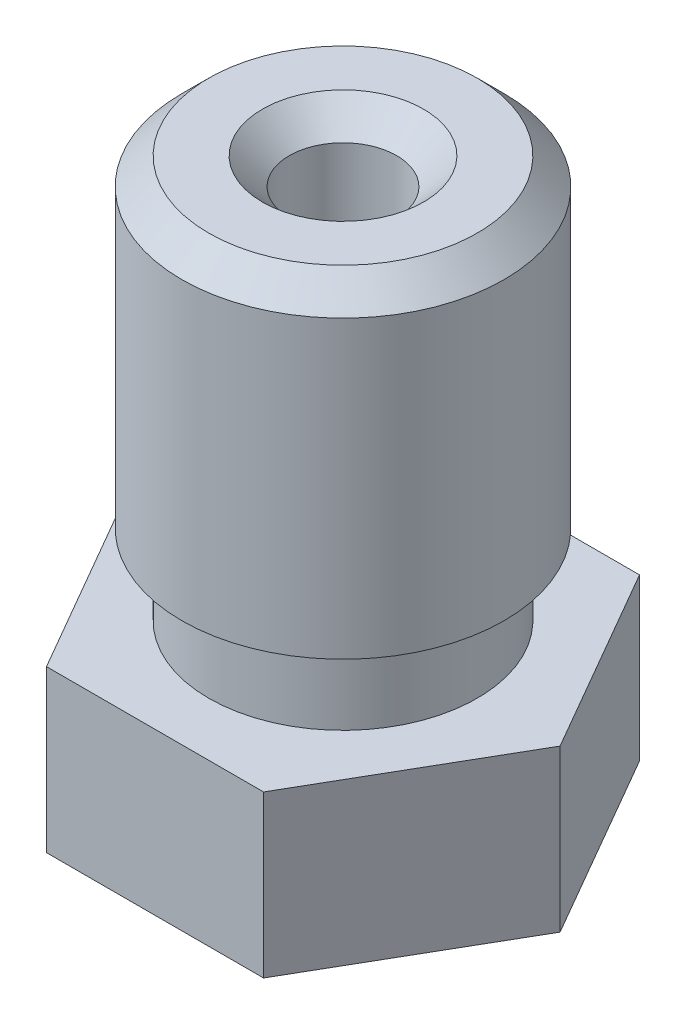
ISO-10303-21;
HEADER;
FILE_DESCRIPTION(('STEP AP214'),'2;1');
FILE_NAME('part.step','',(''),(''),'','','');
FILE_SCHEMA(('AUTOMOTIVE_DESIGN { 1 0 10303 214 1 1 1 1 }'));
ENDSEC;
DATA;
#1=APPLICATION_CONTEXT('core data for automotive mechanical design processes');
#2=APPLICATION_PROTOCOL_DEFINITION('international standard','automotive_design',2000,#1);
#3=PRODUCT_CONTEXT('',#1,'mechanical');
#4=PRODUCT('Part','Part','',(#3));
#5=PRODUCT_RELATED_PRODUCT_CATEGORY('part','',(#4));
#6=PRODUCT_DEFINITION_FORMATION('','',#4);
#7=PRODUCT_DEFINITION_CONTEXT('part definition',#1,'design');
#8=PRODUCT_DEFINITION('design','',#6,#7);
#9=PRODUCT_DEFINITION_SHAPE('','',#8);
#10=(LENGTH_UNIT() NAMED_UNIT(*) SI_UNIT(.MILLI.,.METRE.));
#11=(NAMED_UNIT(*) PLANE_ANGLE_UNIT() SI_UNIT($,.RADIAN.));
#12=(NAMED_UNIT(*) SI_UNIT($,.STERADIAN.) SOLID_ANGLE_UNIT());
#13=UNCERTAINTY_MEASURE_WITH_UNIT(LENGTH_MEASURE(1.E-05),#10,'distance_accuracy_value','');
#14=(GEOMETRIC_REPRESENTATION_CONTEXT(3) GLOBAL_UNCERTAINTY_ASSIGNED_CONTEXT((#13)) GLOBAL_UNIT_ASSIGNED_CONTEXT((#10,
#11,#12)) REPRESENTATION_CONTEXT('',''));
#15=CARTESIAN_POINT('',(0.,0.,0.));
#16=DIRECTION('',(0.,0.,1.));
#17=DIRECTION('',(1.,0.,0.));
#18=AXIS2_PLACEMENT_3D('',#15,#16,#17);
#19=CARTESIAN_POINT('',(0.,4.5,0.));
#20=DIRECTION('',(0.,1.,0.));
#21=DIRECTION('',(0.,0.,1.));
#22=AXIS2_PLACEMENT_3D('',#19,#20,#21);
#23=CYLINDRICAL_SURFACE('',#22,3.);
#24=CARTESIAN_POINT('',(0.,9.9999999999834,0.));
#25=DIRECTION('',(0.,1.,0.));
#26=DIRECTION('',(0.,0.,1.));
#27=AXIS2_PLACEMENT_3D('',#24,#25,#26);
#28=CIRCLE('',#27,3.);
#29=CARTESIAN_POINT('',(0.,9.9999999999834,3.));
#30=VERTEX_POINT('',#29);
#31=EDGE_CURVE('E11',#30,#30,#28,.F.);
#32=ORIENTED_EDGE('',*,*,#31,.T.);
#33=EDGE_LOOP('',(#32));
#34=FACE_BOUND('',#33,.T.);
#35=CARTESIAN_POINT('',(0.,4.5,0.));
#36=DIRECTION('',(0.,1.,0.));
#37=DIRECTION('',(0.,0.,1.));
#38=AXIS2_PLACEMENT_3D('',#35,#36,#37);
#39=CIRCLE('',#38,3.);
#40=CARTESIAN_POINT('',(0.,4.5,3.));
#41=VERTEX_POINT('',#40);
#42=EDGE_CURVE('E151',#41,#41,#39,.T.);
#43=ORIENTED_EDGE('',*,*,#42,.T.);
#44=EDGE_LOOP('',(#43));
#45=FACE_BOUND('',#44,.T.);
#46=ADVANCED_FACE('F37',(#34,#45),#23,.T.);
#47=CARTESIAN_POINT('',(3.,4.5,0.));
#48=DIRECTION('',(0.,-1.,0.));
#49=DIRECTION('',(0.,0.,-1.));
#50=AXIS2_PLACEMENT_3D('',#47,#48,#49);
#51=PLANE('',#50);
#52=CARTESIAN_POINT('',(0.,4.5,0.));
#53=DIRECTION('',(0.,-1.,0.));
#54=DIRECTION('',(0.,0.,-1.));
#55=AXIS2_PLACEMENT_3D('',#52,#53,#54);
#56=CIRCLE('',#55,2.5);
#57=CARTESIAN_POINT('',(0.,4.5,-2.5));
#58=VERTEX_POINT('',#57);
#59=EDGE_CURVE('E152',#58,#58,#56,.T.);
#60=ORIENTED_EDGE('',*,*,#59,.F.);
#61=EDGE_LOOP('',(#60));
#62=FACE_BOUND('',#61,.T.);
#63=ORIENTED_EDGE('',*,*,#42,.F.);
#64=EDGE_LOOP('',(#63));
#65=FACE_BOUND('',#64,.T.);
#66=ADVANCED_FACE('F218',(#62,#65),#51,.T.);
#67=CARTESIAN_POINT('',(0.,10.5,0.));
#68=DIRECTION('',(0.,1.,0.));
#69=DIRECTION('',(0.,0.,1.));
#70=AXIS2_PLACEMENT_3D('',#67,#68,#69);
#71=PLANE('',#70);
#72=CARTESIAN_POINT('',(-1.10963134903613E-11,10.5,0.));
#73=DIRECTION('',(0.,1.,0.));
#74=DIRECTION('',(0.,0.,1.));
#75=AXIS2_PLACEMENT_3D('',#72,#73,#74);
#76=CIRCLE('',#75,1.5000000000277);
#77=CARTESIAN_POINT('',(-1.10963134903613E-11,10.5,1.5000000000277));
#78=VERTEX_POINT('',#77);
#79=EDGE_CURVE('E46',#78,#78,#76,.F.);
#80=ORIENTED_EDGE('',*,*,#79,.T.);
#81=EDGE_LOOP('',(#80));
#82=FACE_BOUND('',#81,.T.);
#83=CARTESIAN_POINT('',(0.,10.5,0.));
#84=DIRECTION('',(0.,1.,0.));
#85=DIRECTION('',(0.,0.,1.));
#86=AXIS2_PLACEMENT_3D('',#83,#84,#85);
#87=CIRCLE('',#86,2.4999999999834);
#88=CARTESIAN_POINT('',(0.,10.5,2.4999999999834));
#89=VERTEX_POINT('',#88);
#90=EDGE_CURVE('E161',#89,#89,#87,.T.);
#91=ORIENTED_EDGE('',*,*,#90,.T.);
#92=EDGE_LOOP('',(#91));
#93=FACE_BOUND('',#92,.T.);
#94=ADVANCED_FACE('F166',(#82,#93),#71,.T.);
#95=CARTESIAN_POINT('',(0.,3.,0.));
#96=DIRECTION('',(0.,1.,0.));
#97=DIRECTION('',(0.,0.,1.));
#98=AXIS2_PLACEMENT_3D('',#95,#96,#97);
#99=CYLINDRICAL_SURFACE('',#98,2.5);
#100=CARTESIAN_POINT('',(0.,3.,0.));
#101=DIRECTION('',(0.,-1.,0.));
#102=DIRECTION('',(0.,0.,-1.));
#103=AXIS2_PLACEMENT_3D('',#100,#101,#102);
#104=CIRCLE('',#103,2.5);
#105=CARTESIAN_POINT('',(0.,3.,-2.5));
#106=VERTEX_POINT('',#105);
#107=EDGE_CURVE('E143',#106,#106,#104,.T.);
#108=ORIENTED_EDGE('',*,*,#107,.F.);
#109=EDGE_LOOP('',(#108));
#110=FACE_BOUND('',#109,.T.);
#111=ORIENTED_EDGE('',*,*,#59,.T.);
#112=EDGE_LOOP('',(#111));
#113=FACE_BOUND('',#112,.T.);
#114=ADVANCED_FACE('F214',(#110,#113),#99,.T.);
#115=CARTESIAN_POINT('',(-4.04145188432738,0.,0.));
#116=DIRECTION('',(-0.866025403784439,0.,0.5));
#117=DIRECTION('',(0.5,0.,0.866025403784439));
#118=AXIS2_PLACEMENT_3D('',#115,#116,#117);
#119=PLANE('',#118);
#120=DIRECTION('',(0.5,0.,0.866025403784439));
#121=VECTOR('',#120,1.);
#122=CARTESIAN_POINT('',(-4.04145188432738,3.,0.));
#123=LINE('',#122,#121);
#124=CARTESIAN_POINT('',(-4.04145188432738,3.,0.));
#125=VERTEX_POINT('',#124);
#126=CARTESIAN_POINT('',(-2.02072594216369,3.,3.5));
#127=VERTEX_POINT('',#126);
#128=EDGE_CURVE('E125',#125,#127,#123,.T.);
#129=ORIENTED_EDGE('',*,*,#128,.F.);
#130=DIRECTION('',(0.,1.,0.));
#131=VECTOR('',#130,1.);
#132=CARTESIAN_POINT('',(-4.04145188432738,0.,0.));
#133=LINE('',#132,#131);
#134=CARTESIAN_POINT('',(-4.04145188432738,0.,0.));
#135=VERTEX_POINT('',#134);
#136=EDGE_CURVE('E54',#135,#125,#133,.T.);
#137=ORIENTED_EDGE('',*,*,#136,.F.);
#138=DIRECTION('',(0.5,0.,0.866025403784439));
#139=VECTOR('',#138,1.);
#140=CARTESIAN_POINT('',(-4.04145188432738,0.,0.));
#141=LINE('',#140,#139);
#142=CARTESIAN_POINT('',(-2.02072594216369,0.,3.5));
#143=VERTEX_POINT('',#142);
#144=EDGE_CURVE('E141',#135,#143,#141,.T.);
#145=ORIENTED_EDGE('',*,*,#144,.T.);
#146=DIRECTION('',(0.,1.,0.));
#147=VECTOR('',#146,1.);
#148=CARTESIAN_POINT('',(-2.02072594216369,0.,3.5));
#149=LINE('',#148,#147);
#150=EDGE_CURVE('E89',#143,#127,#149,.T.);
#151=ORIENTED_EDGE('',*,*,#150,.T.);
#152=EDGE_LOOP('',(#129,#137,#145,#151));
#153=FACE_BOUND('',#152,.T.);
#154=ADVANCED_FACE('F203',(#153),#119,.T.);
#155=CARTESIAN_POINT('',(-2.02072594216369,0.,-3.5));
#156=DIRECTION('',(-0.866025403784439,0.,-0.5));
#157=DIRECTION('',(-0.5,0.,0.866025403784439));
#158=AXIS2_PLACEMENT_3D('',#155,#156,#157);
#159=PLANE('',#158);
#160=DIRECTION('',(-0.5,0.,0.866025403784439));
#161=VECTOR('',#160,1.);
#162=CARTESIAN_POINT('',(-2.02072594216369,3.,-3.5));
#163=LINE('',#162,#161);
#164=CARTESIAN_POINT('',(-2.02072594216369,3.,-3.5));
#165=VERTEX_POINT('',#164);
#166=EDGE_CURVE('E138',#165,#125,#163,.T.);
#167=ORIENTED_EDGE('',*,*,#166,.F.);
#168=DIRECTION('',(0.,1.,0.));
#169=VECTOR('',#168,1.);
#170=CARTESIAN_POINT('',(-2.02072594216369,0.,-3.5));
#171=LINE('',#170,#169);
#172=CARTESIAN_POINT('',(-2.02072594216369,0.,-3.5));
#173=VERTEX_POINT('',#172);
#174=EDGE_CURVE('E77',#173,#165,#171,.T.);
#175=ORIENTED_EDGE('',*,*,#174,.F.);
#176=DIRECTION('',(-0.5,0.,0.866025403784439));
#177=VECTOR('',#176,1.);
#178=CARTESIAN_POINT('',(-2.02072594216369,0.,-3.5));
#179=LINE('',#178,#177);
#180=EDGE_CURVE('E115',#173,#135,#179,.T.);
#181=ORIENTED_EDGE('',*,*,#180,.T.);
#182=ORIENTED_EDGE('',*,*,#136,.T.);
#183=EDGE_LOOP('',(#167,#175,#181,#182));
#184=FACE_BOUND('',#183,.T.);
#185=ADVANCED_FACE('F206',(#184),#159,.T.);
#186=CARTESIAN_POINT('',(2.02072594216369,0.,-3.5));
#187=DIRECTION('',(0.,0.,-1.));
#188=DIRECTION('',(-1.,0.,0.));
#189=AXIS2_PLACEMENT_3D('',#186,#187,#188);
#190=PLANE('',#189);
#191=DIRECTION('',(-1.,0.,0.));
#192=VECTOR('',#191,1.);
#193=CARTESIAN_POINT('',(2.02072594216369,3.,-3.5));
#194=LINE('',#193,#192);
#195=CARTESIAN_POINT('',(2.02072594216369,3.,-3.5));
#196=VERTEX_POINT('',#195);
#197=EDGE_CURVE('E102',#196,#165,#194,.T.);
#198=ORIENTED_EDGE('',*,*,#197,.F.);
#199=DIRECTION('',(0.,1.,0.));
#200=VECTOR('',#199,1.);
#201=CARTESIAN_POINT('',(2.02072594216369,0.,-3.5));
#202=LINE('',#201,#200);
#203=CARTESIAN_POINT('',(2.02072594216369,0.,-3.5));
#204=VERTEX_POINT('',#203);
#205=EDGE_CURVE('E97',#204,#196,#202,.T.);
#206=ORIENTED_EDGE('',*,*,#205,.F.);
#207=DIRECTION('',(-1.,0.,0.));
#208=VECTOR('',#207,1.);
#209=CARTESIAN_POINT('',(2.02072594216369,0.,-3.5));
#210=LINE('',#209,#208);
#211=EDGE_CURVE('E100',#204,#173,#210,.T.);
#212=ORIENTED_EDGE('',*,*,#211,.T.);
#213=ORIENTED_EDGE('',*,*,#174,.T.);
#214=EDGE_LOOP('',(#198,#206,#212,#213));
#215=FACE_BOUND('',#214,.T.);
#216=ADVANCED_FACE('F99',(#215),#190,.T.);
#217=CARTESIAN_POINT('',(4.04145188432738,0.,0.));
#218=DIRECTION('',(0.866025403784439,0.,-0.5));
#219=DIRECTION('',(-0.5,0.,-0.866025403784439));
#220=AXIS2_PLACEMENT_3D('',#217,#218,#219);
#221=PLANE('',#220);
#222=DIRECTION('',(-0.5,0.,-0.866025403784439));
#223=VECTOR('',#222,1.);
#224=CARTESIAN_POINT('',(4.04145188432738,3.,0.));
#225=LINE('',#224,#223);
#226=CARTESIAN_POINT('',(4.04145188432738,3.,0.));
#227=VERTEX_POINT('',#226);
#228=EDGE_CURVE('E135',#227,#196,#225,.T.);
#229=ORIENTED_EDGE('',*,*,#228,.F.);
#230=DIRECTION('',(0.,1.,0.));
#231=VECTOR('',#230,1.);
#232=CARTESIAN_POINT('',(4.04145188432738,0.,0.));
#233=LINE('',#232,#231);
#234=CARTESIAN_POINT('',(4.04145188432738,0.,0.));
#235=VERTEX_POINT('',#234);
#236=EDGE_CURVE('E107',#235,#227,#233,.T.);
#237=ORIENTED_EDGE('',*,*,#236,.F.);
#238=DIRECTION('',(-0.5,0.,-0.866025403784439));
#239=VECTOR('',#238,1.);
#240=CARTESIAN_POINT('',(4.04145188432738,0.,0.));
#241=LINE('',#240,#239);
#242=EDGE_CURVE('E113',#235,#204,#241,.T.);
#243=ORIENTED_EDGE('',*,*,#242,.T.);
#244=ORIENTED_EDGE('',*,*,#205,.T.);
#245=EDGE_LOOP('',(#229,#237,#243,#244));
#246=FACE_BOUND('',#245,.T.);
#247=ADVANCED_FACE('F117',(#246),#221,.T.);
#248=CARTESIAN_POINT('',(2.02072594216369,0.,3.5));
#249=DIRECTION('',(0.866025403784439,0.,0.5));
#250=DIRECTION('',(0.5,0.,-0.866025403784439));
#251=AXIS2_PLACEMENT_3D('',#248,#249,#250);
#252=PLANE('',#251);
#253=DIRECTION('',(0.5,0.,-0.866025403784439));
#254=VECTOR('',#253,1.);
#255=CARTESIAN_POINT('',(2.02072594216369,3.,3.5));
#256=LINE('',#255,#254);
#257=CARTESIAN_POINT('',(2.02072594216369,3.,3.5));
#258=VERTEX_POINT('',#257);
#259=EDGE_CURVE('E132',#258,#227,#256,.T.);
#260=ORIENTED_EDGE('',*,*,#259,.F.);
#261=DIRECTION('',(0.,1.,0.));
#262=VECTOR('',#261,1.);
#263=CARTESIAN_POINT('',(2.02072594216369,0.,3.5));
#264=LINE('',#263,#262);
#265=CARTESIAN_POINT('',(2.02072594216369,0.,3.5));
#266=VERTEX_POINT('',#265);
#267=EDGE_CURVE('E146',#266,#258,#264,.T.);
#268=ORIENTED_EDGE('',*,*,#267,.F.);
#269=DIRECTION('',(0.5,0.,-0.866025403784439));
#270=VECTOR('',#269,1.);
#271=CARTESIAN_POINT('',(2.02072594216369,0.,3.5));
#272=LINE('',#271,#270);
#273=EDGE_CURVE('E118',#266,#235,#272,.T.);
#274=ORIENTED_EDGE('',*,*,#273,.T.);
#275=ORIENTED_EDGE('',*,*,#236,.T.);
#276=EDGE_LOOP('',(#260,#268,#274,#275));
#277=FACE_BOUND('',#276,.T.);
#278=ADVANCED_FACE('F235',(#277),#252,.T.);
#279=CARTESIAN_POINT('',(-2.02072594216369,0.,3.5));
#280=DIRECTION('',(0.,0.,1.));
#281=DIRECTION('',(1.,0.,0.));
#282=AXIS2_PLACEMENT_3D('',#279,#280,#281);
#283=PLANE('',#282);
#284=DIRECTION('',(1.,0.,0.));
#285=VECTOR('',#284,1.);
#286=CARTESIAN_POINT('',(-2.02072594216369,3.,3.5));
#287=LINE('',#286,#285);
#288=EDGE_CURVE('E128',#127,#258,#287,.T.);
#289=ORIENTED_EDGE('',*,*,#288,.F.);
#290=ORIENTED_EDGE('',*,*,#150,.F.);
#291=DIRECTION('',(1.,0.,0.));
#292=VECTOR('',#291,1.);
#293=CARTESIAN_POINT('',(-2.02072594216369,0.,3.5));
#294=LINE('',#293,#292);
#295=EDGE_CURVE('E120',#143,#266,#294,.T.);
#296=ORIENTED_EDGE('',*,*,#295,.T.);
#297=ORIENTED_EDGE('',*,*,#267,.T.);
#298=EDGE_LOOP('',(#289,#290,#296,#297));
#299=FACE_BOUND('',#298,.T.);
#300=ADVANCED_FACE('F201',(#299),#283,.T.);
#301=CARTESIAN_POINT('',(0.,0.,0.));
#302=DIRECTION('',(0.,1.,0.));
#303=DIRECTION('',(0.,0.,1.));
#304=AXIS2_PLACEMENT_3D('',#301,#302,#303);
#305=PLANE('',#304);
#306=CARTESIAN_POINT('',(0.,0.,0.));
#307=DIRECTION('',(0.,-1.,0.));
#308=DIRECTION('',(0.,0.,-1.));
#309=AXIS2_PLACEMENT_3D('',#306,#307,#308);
#310=CIRCLE('',#309,2.50000000004502);
#311=CARTESIAN_POINT('',(0.,0.,-2.50000000004502));
#312=VERTEX_POINT('',#311);
#313=EDGE_CURVE('E155',#312,#312,#310,.T.);
#314=ORIENTED_EDGE('',*,*,#313,.F.);
#315=EDGE_LOOP('',(#314));
#316=FACE_BOUND('',#315,.T.);
#317=ORIENTED_EDGE('',*,*,#144,.F.);
#318=ORIENTED_EDGE('',*,*,#180,.F.);
#319=ORIENTED_EDGE('',*,*,#211,.F.);
#320=ORIENTED_EDGE('',*,*,#242,.F.);
#321=ORIENTED_EDGE('',*,*,#273,.F.);
#322=ORIENTED_EDGE('',*,*,#295,.F.);
#323=EDGE_LOOP('',(#317,#318,#319,#320,#321,#322));
#324=FACE_BOUND('',#323,.T.);
#325=ADVANCED_FACE('F111',(#316,#324),#305,.F.);
#326=CARTESIAN_POINT('',(0.,3.,0.));
#327=DIRECTION('',(0.,1.,0.));
#328=DIRECTION('',(0.,0.,1.));
#329=AXIS2_PLACEMENT_3D('',#326,#327,#328);
#330=PLANE('',#329);
#331=ORIENTED_EDGE('',*,*,#107,.T.);
#332=EDGE_LOOP('',(#331));
#333=FACE_BOUND('',#332,.T.);
#334=ORIENTED_EDGE('',*,*,#128,.T.);
#335=ORIENTED_EDGE('',*,*,#288,.T.);
#336=ORIENTED_EDGE('',*,*,#259,.T.);
#337=ORIENTED_EDGE('',*,*,#228,.T.);
#338=ORIENTED_EDGE('',*,*,#197,.T.);
#339=ORIENTED_EDGE('',*,*,#166,.T.);
#340=EDGE_LOOP('',(#334,#335,#336,#337,#338,#339));
#341=FACE_BOUND('',#340,.T.);
#342=ADVANCED_FACE('F205',(#333,#341),#330,.T.);
#343=CARTESIAN_POINT('',(0.,0.,0.));
#344=DIRECTION('',(0.,1.,0.));
#345=DIRECTION('',(0.,0.,-1.));
#346=AXIS2_PLACEMENT_3D('',#343,#344,#345);
#347=CONICAL_SURFACE('',#346,2.50000000004502,0.785398163397445);
#348=CARTESIAN_POINT('',(0.,-2.,0.));
#349=DIRECTION('',(0.,-1.,0.));
#350=DIRECTION('',(0.,0.,-1.));
#351=AXIS2_PLACEMENT_3D('',#348,#349,#350);
#352=CIRCLE('',#351,0.500000000045032);
#353=CARTESIAN_POINT('',(0.,-2.,-0.500000000045033));
#354=VERTEX_POINT('',#353);
#355=EDGE_CURVE('E129',#354,#354,#352,.T.);
#356=CARTESIAN_POINT('',(0.,-2.,-0.500000000045033));
#357=CARTESIAN_POINT('',(0.,-1.97916666666667,-0.520833333378366));
#358=CARTESIAN_POINT('',(0.,-1.95833333333333,-0.5416666667117));
#359=CARTESIAN_POINT('',(0.,-1.91666666666667,-0.583333333378366));
#360=CARTESIAN_POINT('',(0.,-1.89583333333333,-0.604166666711699));
#361=CARTESIAN_POINT('',(0.,-1.85416666666667,-0.645833333378366));
#362=CARTESIAN_POINT('',(0.,-1.83333333333333,-0.666666666711699));
#363=CARTESIAN_POINT('',(0.,-1.79166666666667,-0.708333333378365));
#364=CARTESIAN_POINT('',(0.,-1.77083333333333,-0.729166666711698));
#365=CARTESIAN_POINT('',(0.,-1.72916666666667,-0.770833333378365));
#366=CARTESIAN_POINT('',(0.,-1.70833333333333,-0.791666666711698));
#367=CARTESIAN_POINT('',(0.,-1.66666666666667,-0.833333333378365));
#368=CARTESIAN_POINT('',(0.,-1.64583333333333,-0.854166666711698));
#369=CARTESIAN_POINT('',(0.,-1.60416666666667,-0.895833333378364));
#370=CARTESIAN_POINT('',(0.,-1.58333333333333,-0.916666666711697));
#371=CARTESIAN_POINT('',(0.,-1.54166666666667,-0.958333333378364));
#372=CARTESIAN_POINT('',(0.,-1.52083333333333,-0.979166666711697));
#373=CARTESIAN_POINT('',(0.,-1.47916666666667,-1.02083333337836));
#374=CARTESIAN_POINT('',(0.,-1.45833333333333,-1.0416666667117));
#375=CARTESIAN_POINT('',(0.,-1.41666666666667,-1.08333333337836));
#376=CARTESIAN_POINT('',(0.,-1.39583333333333,-1.1041666667117));
#377=CARTESIAN_POINT('',(0.,-1.35416666666667,-1.14583333337836));
#378=CARTESIAN_POINT('',(0.,-1.33333333333333,-1.1666666667117));
#379=CARTESIAN_POINT('',(0.,-1.29166666666667,-1.20833333337836));
#380=CARTESIAN_POINT('',(0.,-1.27083333333333,-1.2291666667117));
#381=CARTESIAN_POINT('',(0.,-1.22916666666667,-1.27083333337836));
#382=CARTESIAN_POINT('',(0.,-1.20833333333333,-1.2916666667117));
#383=CARTESIAN_POINT('',(0.,-1.16666666666667,-1.33333333337836));
#384=CARTESIAN_POINT('',(0.,-1.14583333333333,-1.35416666671169));
#385=CARTESIAN_POINT('',(0.,-1.10416666666667,-1.39583333337836));
#386=CARTESIAN_POINT('',(0.,-1.08333333333333,-1.41666666671169));
#387=CARTESIAN_POINT('',(0.,-1.04166666666667,-1.45833333337836));
#388=CARTESIAN_POINT('',(0.,-1.02083333333333,-1.47916666671169));
#389=CARTESIAN_POINT('',(0.,-0.979166666666667,-1.52083333337836));
#390=CARTESIAN_POINT('',(0.,-0.958333333333333,-1.54166666671169));
#391=CARTESIAN_POINT('',(0.,-0.916666666666667,-1.58333333337836));
#392=CARTESIAN_POINT('',(0.,-0.895833333333333,-1.60416666671169));
#393=CARTESIAN_POINT('',(0.,-0.854166666666667,-1.64583333337836));
#394=CARTESIAN_POINT('',(0.,-0.833333333333333,-1.66666666671169));
#395=CARTESIAN_POINT('',(0.,-0.791666666666667,-1.70833333337836));
#396=CARTESIAN_POINT('',(0.,-0.770833333333333,-1.72916666671169));
#397=CARTESIAN_POINT('',(0.,-0.729166666666667,-1.77083333337836));
#398=CARTESIAN_POINT('',(0.,-0.708333333333333,-1.79166666671169));
#399=CARTESIAN_POINT('',(0.,-0.666666666666667,-1.83333333337836));
#400=CARTESIAN_POINT('',(0.,-0.645833333333333,-1.85416666671169));
#401=CARTESIAN_POINT('',(0.,-0.604166666666667,-1.89583333337836));
#402=CARTESIAN_POINT('',(0.,-0.583333333333333,-1.91666666671169));
#403=CARTESIAN_POINT('',(0.,-0.541666666666667,-1.95833333337836));
#404=CARTESIAN_POINT('',(0.,-0.520833333333333,-1.97916666671169));
#405=CARTESIAN_POINT('',(0.,-0.479166666666667,-2.02083333337836));
#406=CARTESIAN_POINT('',(0.,-0.458333333333333,-2.04166666671169));
#407=CARTESIAN_POINT('',(0.,-0.416666666666667,-2.08333333337836));
#408=CARTESIAN_POINT('',(0.,-0.395833333333333,-2.10416666671169));
#409=CARTESIAN_POINT('',(0.,-0.354166666666667,-2.14583333337836));
#410=CARTESIAN_POINT('',(0.,-0.333333333333333,-2.16666666671169));
#411=CARTESIAN_POINT('',(0.,-0.291666666666667,-2.20833333337836));
#412=CARTESIAN_POINT('',(0.,-0.270833333333333,-2.22916666671169));
#413=CARTESIAN_POINT('',(0.,-0.229166666666667,-2.27083333337836));
#414=CARTESIAN_POINT('',(0.,-0.208333333333333,-2.29166666671169));
#415=CARTESIAN_POINT('',(0.,-0.166666666666667,-2.33333333337836));
#416=CARTESIAN_POINT('',(0.,-0.145833333333333,-2.35416666671169));
#417=CARTESIAN_POINT('',(0.,-0.104166666666667,-2.39583333337835));
#418=CARTESIAN_POINT('',(0.,-0.0833333333333334,-2.41666666671169));
#419=CARTESIAN_POINT('',(0.,-0.0416666666666667,-2.45833333337835));
#420=CARTESIAN_POINT('',(0.,-0.0208333333333333,-2.47916666671169));
#421=CARTESIAN_POINT('',(0.,0.,-2.50000000004502));
#422=B_SPLINE_CURVE_WITH_KNOTS('',3,(#356,#357,#358,#359,#360,#361,#362,#363,#364,#365,#366,
#367,#368,#369,#370,#371,#372,#373,#374,#375,#376,#377,#378,#379,#380,#381,#382,#383,#384,#385,
#386,#387,#388,#389,#390,#391,#392,#393,#394,#395,#396,#397,#398,#399,#400,#401,#402,#403,#404,
#405,#406,#407,#408,#409,#410,#411,#412,#413,#414,#415,#416,#417,#418,#419,#420,#421),
.UNSPECIFIED.,.F.,.F.,(4,2,2,2,2,2,2,2,2,2,2,2,2,2,2,2,2,2,2,2,2,2,2,2,2,2,2,2,2,2,2,2,4),(0.,
0.0883883476483184,0.176776695296637,0.265165042944954,0.353553390593273,0.441941738241591,
0.530330085889909,0.618718433538227,0.707106781186545,0.795495128834864,0.883883476483182,
0.9722718241315,1.06066017177982,1.14904851942814,1.23743686707645,1.32582521472477,
1.41421356237309,1.50260191002141,1.59099025766973,1.67937860531805,1.76776695296636,
1.85615530061468,1.944543648263,2.03293199591132,2.12132034355964,2.20970869120795,
2.29809703885627,2.38648538650459,2.47487373415291,2.56326208180123,2.65165042944954,
2.74003877709786,2.82842712474618),.UNSPECIFIED.);
#423=EDGE_CURVE('BSEAM266',#354,#312,#422,.T.);
#424=ORIENTED_EDGE('',*,*,#355,.F.);
#425=ORIENTED_EDGE('',*,*,#313,.T.);
#426=ORIENTED_EDGE('',*,*,#423,.T.);
#427=ORIENTED_EDGE('',*,*,#423,.F.);
#428=EDGE_LOOP('',(#424,#426,#425,#427));
#429=FACE_BOUND('',#428,.T.);
#430=ADVANCED_FACE('F266',(#429),#347,.T.);
#431=CARTESIAN_POINT('',(0.,-2.,0.));
#432=DIRECTION('',(0.,-1.,0.));
#433=DIRECTION('',(0.,0.,-1.));
#434=AXIS2_PLACEMENT_3D('',#431,#432,#433);
#435=PLANE('',#434);
#436=CARTESIAN_POINT('',(-1.10963134903613E-11,-2.,0.));
#437=DIRECTION('',(0.,-1.,0.));
#438=DIRECTION('',(0.,0.,1.));
#439=AXIS2_PLACEMENT_3D('',#436,#437,#438);
#440=CIRCLE('',#439,0.2);
#441=CARTESIAN_POINT('',(-1.10963134903613E-11,-2.,0.2));
#442=VERTEX_POINT('',#441);
#443=EDGE_CURVE('E194',#442,#442,#440,.T.);
#444=ORIENTED_EDGE('',*,*,#443,.F.);
#445=EDGE_LOOP('',(#444));
#446=FACE_BOUND('',#445,.T.);
#447=ORIENTED_EDGE('',*,*,#355,.T.);
#448=EDGE_LOOP('',(#447));
#449=FACE_BOUND('',#448,.T.);
#450=ADVANCED_FACE('F272',(#446,#449),#435,.T.);
#451=CARTESIAN_POINT('',(-1.10963134903613E-11,-1.20000000003984,0.));
#452=DIRECTION('',(0.,-1.,0.));
#453=DIRECTION('',(0.,0.,-1.));
#454=AXIS2_PLACEMENT_3D('',#451,#452,#453);
#455=CYLINDRICAL_SURFACE('',#454,0.2);
#456=CARTESIAN_POINT('',(-1.10963134903613E-11,-1.20000000003984,0.));
#457=DIRECTION('',(0.,-1.,0.));
#458=DIRECTION('',(0.,0.,1.));
#459=AXIS2_PLACEMENT_3D('',#456,#457,#458);
#460=CIRCLE('',#459,0.199999999999997);
#461=CARTESIAN_POINT('',(-1.10963134903613E-11,-1.20000000003984,0.199999999999997));
#462=VERTEX_POINT('',#461);
#463=EDGE_CURVE('E191',#462,#462,#460,.T.);
#464=ORIENTED_EDGE('',*,*,#463,.F.);
#465=EDGE_LOOP('',(#464));
#466=FACE_BOUND('',#465,.T.);
#467=ORIENTED_EDGE('',*,*,#443,.T.);
#468=EDGE_LOOP('',(#467));
#469=FACE_BOUND('',#468,.T.);
#470=ADVANCED_FACE('F280',(#466,#469),#455,.F.);
#471=CARTESIAN_POINT('',(-1.10963134903613E-11,-1.20000000003984,0.));
#472=DIRECTION('',(0.,1.,0.));
#473=DIRECTION('',(0.,0.,1.));
#474=AXIS2_PLACEMENT_3D('',#471,#472,#473);
#475=CONICAL_SURFACE('',#474,0.199999999999997,0.832981266628773);
#476=CARTESIAN_POINT('',(-1.10963134903613E-11,-0.7,0.));
#477=DIRECTION('',(0.,-1.,0.));
#478=DIRECTION('',(0.,0.,1.));
#479=AXIS2_PLACEMENT_3D('',#476,#477,#478);
#480=CIRCLE('',#479,0.749999999993361);
#481=CARTESIAN_POINT('',(-1.10963134903613E-11,-0.7,0.749999999993368));
#482=VERTEX_POINT('',#481);
#483=EDGE_CURVE('E186',#482,#482,#480,.T.);
#484=CARTESIAN_POINT('',(-1.10963134903613E-11,-0.7,0.749999999993368));
#485=CARTESIAN_POINT('',(-1.10963134903613E-11,-0.705208333333748,0.74427083332677));
#486=CARTESIAN_POINT('',(-1.10963134903613E-11,-0.710416666667497,0.738541666660172));
#487=CARTESIAN_POINT('',(-1.10963134903613E-11,-0.720833333334993,0.727083333326977));
#488=CARTESIAN_POINT('',(-1.10963134903613E-11,-0.726041666668742,0.72135416666038));
#489=CARTESIAN_POINT('',(-1.10963134903613E-11,-0.736458333336238,0.709895833327184));
#490=CARTESIAN_POINT('',(-1.10963134903613E-11,-0.741666666669987,0.704166666660587));
#491=CARTESIAN_POINT('',(-1.10963134903613E-11,-0.752083333337483,0.692708333327391));
#492=CARTESIAN_POINT('',(-1.10963134903613E-11,-0.757291666671232,0.686979166660794));
#493=CARTESIAN_POINT('',(-1.10963134903613E-11,-0.767708333338728,0.675520833327598));
#494=CARTESIAN_POINT('',(-1.10963134903613E-11,-0.772916666672477,0.669791666661001));
#495=CARTESIAN_POINT('',(-1.10963134903613E-11,-0.783333333339973,0.658333333327806));
#496=CARTESIAN_POINT('',(-1.10963134903613E-11,-0.788541666673722,0.652604166661208));
#497=CARTESIAN_POINT('',(-1.10963134903613E-11,-0.798958333341218,0.641145833328013));
#498=CARTESIAN_POINT('',(-1.10963134903613E-11,-0.804166666674967,0.635416666661415));
#499=CARTESIAN_POINT('',(-1.10963134903613E-11,-0.814583333342463,0.62395833332822));
#500=CARTESIAN_POINT('',(-1.10963134903613E-11,-0.819791666676212,0.618229166661622));
#501=CARTESIAN_POINT('',(-1.10963134903613E-11,-0.830208333343708,0.606770833328427));
#502=CARTESIAN_POINT('',(-1.10963134903613E-11,-0.835416666677457,0.60104166666183));
#503=CARTESIAN_POINT('',(-1.10963134903613E-11,-0.845833333344953,0.589583333328634));
#504=CARTESIAN_POINT('',(-1.10963134903613E-11,-0.851041666678702,0.583854166662037));
#505=CARTESIAN_POINT('',(-1.10963134903613E-11,-0.861458333346198,0.572395833328842));
#506=CARTESIAN_POINT('',(-1.10963134903613E-11,-0.866666666679947,0.566666666662244));
#507=CARTESIAN_POINT('',(-1.10963134903613E-11,-0.877083333347443,0.555208333329049));
#508=CARTESIAN_POINT('',(-1.10963134903613E-11,-0.882291666681192,0.549479166662451));
#509=CARTESIAN_POINT('',(-1.10963134903613E-11,-0.892708333348688,0.538020833329256));
#510=CARTESIAN_POINT('',(-1.10963134903613E-11,-0.897916666682437,0.532291666662658));
#511=CARTESIAN_POINT('',(-1.10963134903613E-11,-0.908333333349933,0.520833333329463));
#512=CARTESIAN_POINT('',(-1.10963134903613E-11,-0.913541666683682,0.515104166662865));
#513=CARTESIAN_POINT('',(-1.10963134903613E-11,-0.923958333351178,0.50364583332967));
#514=CARTESIAN_POINT('',(-1.10963134903613E-11,-0.929166666684927,0.497916666663073));
#515=CARTESIAN_POINT('',(-1.10963134903613E-11,-0.939583333352423,0.486458333329877));
#516=CARTESIAN_POINT('',(-1.10963134903613E-11,-0.944791666686172,0.48072916666328));
#517=CARTESIAN_POINT('',(-1.10963134903613E-11,-0.955208333353668,0.469270833330085));
#518=CARTESIAN_POINT('',(-1.10963134903613E-11,-0.960416666687417,0.463541666663487));
#519=CARTESIAN_POINT('',(-1.10963134903613E-11,-0.970833333354913,0.452083333330292));
#520=CARTESIAN_POINT('',(-1.10963134903613E-11,-0.976041666688662,0.446354166663694));
#521=CARTESIAN_POINT('',(-1.10963134903613E-11,-0.986458333356158,0.434895833330499));
#522=CARTESIAN_POINT('',(-1.10963134903613E-11,-0.991666666689907,0.429166666663901));
#523=CARTESIAN_POINT('',(-1.10963134903613E-11,-1.0020833333574,0.417708333330706));
#524=CARTESIAN_POINT('',(-1.10963134903613E-11,-1.00729166669115,0.411979166664108));
#525=CARTESIAN_POINT('',(-1.10963134903613E-11,-1.01770833335865,0.400520833330913));
#526=CARTESIAN_POINT('',(-1.10963134903613E-11,-1.0229166666924,0.394791666664316));
#527=CARTESIAN_POINT('',(-1.10963134903613E-11,-1.03333333335989,0.38333333333112));
#528=CARTESIAN_POINT('',(-1.10963134903613E-11,-1.03854166669364,0.377604166664523));
#529=CARTESIAN_POINT('',(-1.10963134903613E-11,-1.04895833336114,0.366145833331327));
#530=CARTESIAN_POINT('',(-1.10963134903613E-11,-1.05416666669489,0.36041666666473));
#531=CARTESIAN_POINT('',(-1.10963134903613E-11,-1.06458333336238,0.348958333331535));
#532=CARTESIAN_POINT('',(-1.10963134903613E-11,-1.06979166669613,0.343229166664937));
#533=CARTESIAN_POINT('',(-1.10963134903613E-11,-1.08020833336363,0.331770833331742));
#534=CARTESIAN_POINT('',(-1.10963134903613E-11,-1.08541666669738,0.326041666665144));
#535=CARTESIAN_POINT('',(-1.10963134903613E-11,-1.09583333336487,0.314583333331949));
#536=CARTESIAN_POINT('',(-1.10963134903613E-11,-1.10104166669862,0.308854166665351));
#537=CARTESIAN_POINT('',(-1.10963134903613E-11,-1.11145833336612,0.297395833332156));
#538=CARTESIAN_POINT('',(-1.10963134903613E-11,-1.11666666669987,0.291666666665559));
#539=CARTESIAN_POINT('',(-1.10963134903613E-11,-1.12708333336736,0.280208333332363));
#540=CARTESIAN_POINT('',(-1.10963134903613E-11,-1.13229166670111,0.274479166665766));
#541=CARTESIAN_POINT('',(-1.10963134903613E-11,-1.14270833336861,0.26302083333257));
#542=CARTESIAN_POINT('',(-1.10963134903613E-11,-1.14791666670236,0.257291666665973));
#543=CARTESIAN_POINT('',(-1.10963134903613E-11,-1.15833333336985,0.245833333332778));
#544=CARTESIAN_POINT('',(-1.10963134903613E-11,-1.1635416667036,0.24010416666618));
#545=CARTESIAN_POINT('',(-1.10963134903613E-11,-1.1739583333711,0.228645833332985));
#546=CARTESIAN_POINT('',(-1.10963134903613E-11,-1.17916666670485,0.222916666666387));
#547=CARTESIAN_POINT('',(-1.10963134903613E-11,-1.18958333337234,0.211458333333192));
#548=CARTESIAN_POINT('',(-1.10963134903613E-11,-1.19479166670609,0.205729166666594));
#549=CARTESIAN_POINT('',(-1.10963134903613E-11,-1.20000000003984,0.199999999999997));
#550=B_SPLINE_CURVE_WITH_KNOTS('',3,(#484,#485,#486,#487,#488,#489,#490,#491,#492,#493,#494,
#495,#496,#497,#498,#499,#500,#501,#502,#503,#504,#505,#506,#507,#508,#509,#510,#511,#512,#513,
#514,#515,#516,#517,#518,#519,#520,#521,#522,#523,#524,#525,#526,#527,#528,#529,#530,#531,#532,
#533,#534,#535,#536,#537,#538,#539,#540,#541,#542,#543,#544,#545,#546,#547,#548,#549),
.UNSPECIFIED.,.F.,.F.,(4,2,2,2,2,2,2,2,2,2,2,2,2,2,2,2,2,2,2,2,2,2,2,2,2,2,2,2,2,2,2,2,4),(0.,
0.0232282324183694,0.0464564648367388,0.0696846972551081,0.0929129296734775,0.116141162091847,
0.139369394510216,0.162597626928586,0.185825859346955,0.209054091765324,0.232282324183694,
0.255510556602063,0.278738789020432,0.301967021438802,0.325195253857171,0.34842348627554,
0.37165171869391,0.394879951112279,0.418108183530648,0.441336415949018,0.464564648367387,
0.487792880785756,0.511021113204126,0.534249345622495,0.557477578040864,0.580705810459234,
0.603934042877603,0.627162275295973,0.650390507714342,0.673618740132711,0.696846972551081,
0.72007520496945,0.743303437387819),.UNSPECIFIED.);
#551=EDGE_CURVE('BSEAM288',#482,#462,#550,.T.);
#552=ORIENTED_EDGE('',*,*,#483,.F.);
#553=ORIENTED_EDGE('',*,*,#463,.T.);
#554=ORIENTED_EDGE('',*,*,#551,.T.);
#555=ORIENTED_EDGE('',*,*,#551,.F.);
#556=EDGE_LOOP('',(#552,#554,#553,#555));
#557=FACE_BOUND('',#556,.T.);
#558=ADVANCED_FACE('F288',(#557),#475,.F.);
#559=CARTESIAN_POINT('',(-1.10963134903613E-11,-0.227272727272521,0.));
#560=DIRECTION('',(0.,-1.,0.));
#561=DIRECTION('',(0.,0.,-1.));
#562=AXIS2_PLACEMENT_3D('',#559,#560,#561);
#563=CYLINDRICAL_SURFACE('',#562,0.749999999993361);
#564=CARTESIAN_POINT('',(-1.10963134903613E-11,-0.227272727272521,0.));
#565=DIRECTION('',(0.,-1.,0.));
#566=DIRECTION('',(0.,0.,1.));
#567=AXIS2_PLACEMENT_3D('',#564,#565,#566);
#568=CIRCLE('',#567,0.74999999999336);
#569=CARTESIAN_POINT('',(-1.10963134903613E-11,-0.227272727272521,0.74999999999336));
#570=VERTEX_POINT('',#569);
#571=EDGE_CURVE('E183',#570,#570,#568,.T.);
#572=ORIENTED_EDGE('',*,*,#571,.F.);
#573=EDGE_LOOP('',(#572));
#574=FACE_BOUND('',#573,.T.);
#575=ORIENTED_EDGE('',*,*,#483,.T.);
#576=EDGE_LOOP('',(#575));
#577=FACE_BOUND('',#576,.T.);
#578=ADVANCED_FACE('F296',(#574,#577),#563,.F.);
#579=CARTESIAN_POINT('',(-1.10963134903613E-11,-0.227272727272521,0.));
#580=DIRECTION('',(0.,1.,0.));
#581=DIRECTION('',(0.,0.,1.));
#582=AXIS2_PLACEMENT_3D('',#579,#580,#581);
#583=CONICAL_SURFACE('',#582,0.74999999999336,0.832981266710201);
#584=CARTESIAN_POINT('',(-1.10963134903613E-11,-1.00891517362811E-11,0.));
#585=DIRECTION('',(0.,1.,0.));
#586=DIRECTION('',(0.,0.,-1.));
#587=AXIS2_PLACEMENT_3D('',#584,#585,#586);
#588=CIRCLE('',#587,1.0000000000111);
#589=CARTESIAN_POINT('',(-1.10963134903613E-11,-1.00891517362811E-11,-1.0000000000111));
#590=VERTEX_POINT('',#589);
#591=EDGE_CURVE('E181',#590,#590,#588,.T.);
#592=ORIENTED_EDGE('',*,*,#591,.T.);
#593=EDGE_LOOP('',(#592));
#594=FACE_BOUND('',#593,.T.);
#595=ORIENTED_EDGE('',*,*,#571,.T.);
#596=EDGE_LOOP('',(#595));
#597=FACE_BOUND('',#596,.T.);
#598=ADVANCED_FACE('F177',(#594,#597),#583,.F.);
#599=CARTESIAN_POINT('',(-1.10963134903613E-11,-1.00891517362811E-11,0.));
#600=DIRECTION('',(0.,1.,0.));
#601=DIRECTION('',(0.,0.,1.));
#602=AXIS2_PLACEMENT_3D('',#599,#600,#601);
#603=CYLINDRICAL_SURFACE('',#602,1.0000000000111);
#604=CARTESIAN_POINT('',(-1.10963134903613E-11,9.9999999999834,0.));
#605=DIRECTION('',(0.,1.,0.));
#606=DIRECTION('',(0.,0.,1.));
#607=AXIS2_PLACEMENT_3D('',#604,#605,#606);
#608=CIRCLE('',#607,1.0000000000111);
#609=CARTESIAN_POINT('',(-1.10963134903613E-11,9.9999999999834,1.0000000000111));
#610=VERTEX_POINT('',#609);
#611=EDGE_CURVE('E158',#610,#610,#608,.T.);
#612=ORIENTED_EDGE('',*,*,#611,.T.);
#613=EDGE_LOOP('',(#612));
#614=FACE_BOUND('',#613,.T.);
#615=ORIENTED_EDGE('',*,*,#591,.F.);
#616=EDGE_LOOP('',(#615));
#617=FACE_BOUND('',#616,.T.);
#618=ADVANCED_FACE('F172',(#614,#617),#603,.F.);
#619=CARTESIAN_POINT('',(-1.10963134903613E-11,9.9999999999834,0.));
#620=DIRECTION('',(0.,1.,0.));
#621=DIRECTION('',(0.,0.,1.));
#622=AXIS2_PLACEMENT_3D('',#619,#620,#621);
#623=CONICAL_SURFACE('',#622,1.0000000000111,0.78539816339745);
#624=ORIENTED_EDGE('',*,*,#79,.F.);
#625=EDGE_LOOP('',(#624));
#626=FACE_BOUND('',#625,.T.);
#627=ORIENTED_EDGE('',*,*,#611,.F.);
#628=EDGE_LOOP('',(#627));
#629=FACE_BOUND('',#628,.T.);
#630=ADVANCED_FACE('F169',(#626,#629),#623,.F.);
#631=CARTESIAN_POINT('',(0.,10.5,0.));
#632=DIRECTION('',(0.,-1.,0.));
#633=DIRECTION('',(0.,0.,-1.));
#634=AXIS2_PLACEMENT_3D('',#631,#632,#633);
#635=CONICAL_SURFACE('',#634,2.4999999999834,0.785398163397447);
#636=ORIENTED_EDGE('',*,*,#31,.F.);
#637=EDGE_LOOP('',(#636));
#638=FACE_BOUND('',#637,.T.);
#639=ORIENTED_EDGE('',*,*,#90,.F.);
#640=EDGE_LOOP('',(#639));
#641=FACE_BOUND('',#640,.T.);
#642=ADVANCED_FACE('F39',(#638,#641),#635,.T.);
#643=CLOSED_SHELL('',(#46,#66,#94,#114,#154,#185,#216,#247,#278,#300,#325,#342,#430,#450,#470,
#558,#578,#598,#618,#630,#642));
#644=MANIFOLD_SOLID_BREP('B2',#643);
#645=ADVANCED_BREP_SHAPE_REPRESENTATION('',(#18,#644),#14);
#646=SHAPE_DEFINITION_REPRESENTATION(#9,#645);
ENDSEC;
END-ISO-10303-21;
